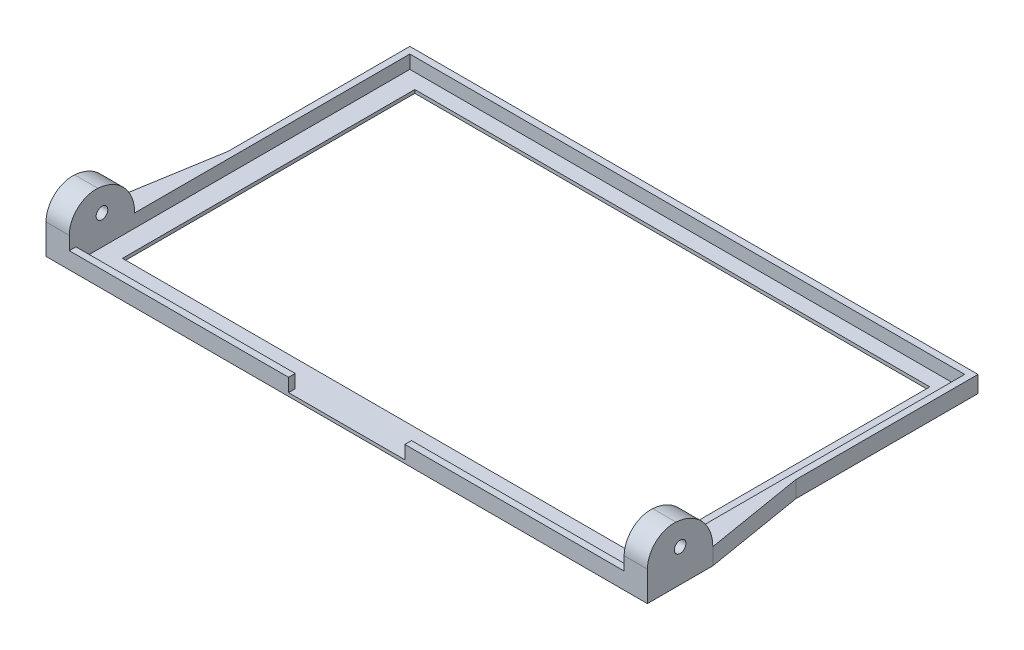
ISO-10303-21;
HEADER;
FILE_DESCRIPTION(('STEP AP214'),'2;1');
FILE_NAME('part.step','',(''),(''),'','','');
FILE_SCHEMA(('AUTOMOTIVE_DESIGN { 1 0 10303 214 1 1 1 1 }'));
ENDSEC;
DATA;
#1=APPLICATION_CONTEXT('core data for automotive mechanical design processes');
#2=APPLICATION_PROTOCOL_DEFINITION('international standard','automotive_design',2000,#1);
#3=PRODUCT_CONTEXT('',#1,'mechanical');
#4=PRODUCT('Part','Part','',(#3));
#5=PRODUCT_RELATED_PRODUCT_CATEGORY('part','',(#4));
#6=PRODUCT_DEFINITION_FORMATION('','',#4);
#7=PRODUCT_DEFINITION_CONTEXT('part definition',#1,'design');
#8=PRODUCT_DEFINITION('design','',#6,#7);
#9=PRODUCT_DEFINITION_SHAPE('','',#8);
#10=(LENGTH_UNIT() NAMED_UNIT(*) SI_UNIT(.MILLI.,.METRE.));
#11=(NAMED_UNIT(*) PLANE_ANGLE_UNIT() SI_UNIT($,.RADIAN.));
#12=(NAMED_UNIT(*) SI_UNIT($,.STERADIAN.) SOLID_ANGLE_UNIT());
#13=UNCERTAINTY_MEASURE_WITH_UNIT(LENGTH_MEASURE(1.E-05),#10,'distance_accuracy_value','');
#14=(GEOMETRIC_REPRESENTATION_CONTEXT(3) GLOBAL_UNCERTAINTY_ASSIGNED_CONTEXT((#13)) GLOBAL_UNIT_ASSIGNED_CONTEXT((#10,
#11,#12)) REPRESENTATION_CONTEXT('',''));
#15=CARTESIAN_POINT('',(0.,0.,0.));
#16=DIRECTION('',(0.,0.,1.));
#17=DIRECTION('',(1.,0.,0.));
#18=AXIS2_PLACEMENT_3D('',#15,#16,#17);
#19=CARTESIAN_POINT('',(0.,5.,0.));
#20=DIRECTION('',(0.,1.,0.));
#21=DIRECTION('',(0.,0.,1.));
#22=AXIS2_PLACEMENT_3D('',#19,#20,#21);
#23=PLANE('',#22);
#24=DIRECTION('',(0.,0.,1.));
#25=VECTOR('',#24,1.);
#26=CARTESIAN_POINT('',(83.5,5.,0.));
#27=LINE('',#26,#25);
#28=CARTESIAN_POINT('',(83.5,5.,52.));
#29=VERTEX_POINT('',#28);
#30=CARTESIAN_POINT('',(83.5000000000001,5.,54.));
#31=VERTEX_POINT('',#30);
#32=EDGE_CURVE('E257',#29,#31,#27,.T.);
#33=ORIENTED_EDGE('',*,*,#32,.F.);
#34=DIRECTION('',(1.,0.,0.));
#35=VECTOR('',#34,1.);
#36=CARTESIAN_POINT('',(-83.5,5.,52.));
#37=LINE('',#36,#35);
#38=CARTESIAN_POINT('',(17.5,5.,52.));
#39=VERTEX_POINT('',#38);
#40=EDGE_CURVE('E316',#39,#29,#37,.T.);
#41=ORIENTED_EDGE('',*,*,#40,.F.);
#42=DIRECTION('',(0.,0.,1.));
#43=VECTOR('',#42,1.);
#44=CARTESIAN_POINT('',(17.5,5.,0.));
#45=LINE('',#44,#43);
#46=CARTESIAN_POINT('',(17.5,5.,54.));
#47=VERTEX_POINT('',#46);
#48=EDGE_CURVE('E300',#39,#47,#45,.T.);
#49=ORIENTED_EDGE('',*,*,#48,.T.);
#50=DIRECTION('',(1.,0.,0.));
#51=VECTOR('',#50,1.);
#52=CARTESIAN_POINT('',(-85.5,5.,54.));
#53=LINE('',#52,#51);
#54=EDGE_CURVE('E361',#47,#31,#53,.T.);
#55=ORIENTED_EDGE('',*,*,#54,.T.);
#56=EDGE_LOOP('',(#33,#41,#49,#55));
#57=FACE_BOUND('',#56,.T.);
#58=ADVANCED_FACE('F41',(#57),#23,.T.);
#59=DIRECTION('',(0.,0.,-1.));
#60=VECTOR('',#59,1.);
#61=CARTESIAN_POINT('',(-83.5,5.,0.));
#62=LINE('',#61,#60);
#63=CARTESIAN_POINT('',(-83.5,5.,54.));
#64=VERTEX_POINT('',#63);
#65=CARTESIAN_POINT('',(-83.5,5.,52.));
#66=VERTEX_POINT('',#65);
#67=EDGE_CURVE('E278',#64,#66,#62,.T.);
#68=ORIENTED_EDGE('',*,*,#67,.F.);
#69=CARTESIAN_POINT('',(-17.5,5.,54.));
#70=VERTEX_POINT('',#69);
#71=EDGE_CURVE('E362',#64,#70,#53,.T.);
#72=ORIENTED_EDGE('',*,*,#71,.T.);
#73=DIRECTION('',(0.,0.,-1.));
#74=VECTOR('',#73,1.);
#75=CARTESIAN_POINT('',(-17.5,5.,0.));
#76=LINE('',#75,#74);
#77=CARTESIAN_POINT('',(-17.5,5.,52.));
#78=VERTEX_POINT('',#77);
#79=EDGE_CURVE('E293',#70,#78,#76,.T.);
#80=ORIENTED_EDGE('',*,*,#79,.T.);
#81=EDGE_CURVE('E317',#66,#78,#37,.T.);
#82=ORIENTED_EDGE('',*,*,#81,.F.);
#83=EDGE_LOOP('',(#68,#72,#80,#82));
#84=FACE_BOUND('',#83,.T.);
#85=ADVANCED_FACE('F557',(#84),#23,.T.);
#86=CARTESIAN_POINT('',(85.5,1.,54.));
#87=DIRECTION('',(0.,0.,-1.));
#88=DIRECTION('',(-1.,0.,0.));
#89=AXIS2_PLACEMENT_3D('',#86,#87,#88);
#90=PLANE('',#89);
#91=DIRECTION('',(0.,1.,0.));
#92=VECTOR('',#91,1.);
#93=CARTESIAN_POINT('',(90.5,0.,54.));
#94=LINE('',#93,#92);
#95=CARTESIAN_POINT('',(90.5,0.,54.));
#96=VERTEX_POINT('',#95);
#97=CARTESIAN_POINT('',(90.5,8.98839697397424,54.));
#98=VERTEX_POINT('',#97);
#99=EDGE_CURVE('E212',#96,#98,#94,.T.);
#100=ORIENTED_EDGE('',*,*,#99,.T.);
#101=DIRECTION('',(1.,0.,0.));
#102=VECTOR('',#101,1.);
#103=CARTESIAN_POINT('',(83.5000000000001,8.98839697397424,54.));
#104=LINE('',#103,#102);
#105=CARTESIAN_POINT('',(83.5,8.98839697397424,54.));
#106=VERTEX_POINT('',#105);
#107=EDGE_CURVE('E477',#98,#106,#104,.F.);
#108=ORIENTED_EDGE('',*,*,#107,.T.);
#109=DIRECTION('',(0.,1.,0.));
#110=VECTOR('',#109,1.);
#111=CARTESIAN_POINT('',(83.5,0.,54.));
#112=LINE('',#111,#110);
#113=EDGE_CURVE('E233',#31,#106,#112,.T.);
#114=ORIENTED_EDGE('',*,*,#113,.F.);
#115=ORIENTED_EDGE('',*,*,#54,.F.);
#116=DIRECTION('',(0.,1.,0.));
#117=VECTOR('',#116,1.);
#118=CARTESIAN_POINT('',(17.5,1.,54.));
#119=LINE('',#118,#117);
#120=CARTESIAN_POINT('',(17.5,1.,54.));
#121=VERTEX_POINT('',#120);
#122=EDGE_CURVE('E304',#121,#47,#119,.T.);
#123=ORIENTED_EDGE('',*,*,#122,.F.);
#124=DIRECTION('',(-1.,0.,0.));
#125=VECTOR('',#124,1.);
#126=CARTESIAN_POINT('',(85.5,1.,54.));
#127=LINE('',#126,#125);
#128=CARTESIAN_POINT('',(-17.5,1.,54.));
#129=VERTEX_POINT('',#128);
#130=EDGE_CURVE('E289',#121,#129,#127,.T.);
#131=ORIENTED_EDGE('',*,*,#130,.T.);
#132=DIRECTION('',(0.,-1.,0.));
#133=VECTOR('',#132,1.);
#134=CARTESIAN_POINT('',(-17.5,1.,54.));
#135=LINE('',#134,#133);
#136=EDGE_CURVE('E297',#70,#129,#135,.T.);
#137=ORIENTED_EDGE('',*,*,#136,.F.);
#138=ORIENTED_EDGE('',*,*,#71,.F.);
#139=DIRECTION('',(0.,1.,0.));
#140=VECTOR('',#139,1.);
#141=CARTESIAN_POINT('',(-83.5,0.,54.));
#142=LINE('',#141,#140);
#143=CARTESIAN_POINT('',(-83.5,8.98839697397422,54.));
#144=VERTEX_POINT('',#143);
#145=EDGE_CURVE('E265',#64,#144,#142,.T.);
#146=ORIENTED_EDGE('',*,*,#145,.T.);
#147=DIRECTION('',(-1.,0.,0.));
#148=VECTOR('',#147,1.);
#149=CARTESIAN_POINT('',(-90.5,8.98839697397422,54.));
#150=LINE('',#149,#148);
#151=CARTESIAN_POINT('',(-90.5,8.98839697397422,54.));
#152=VERTEX_POINT('',#151);
#153=EDGE_CURVE('E474',#144,#152,#150,.T.);
#154=ORIENTED_EDGE('',*,*,#153,.T.);
#155=DIRECTION('',(0.,1.,0.));
#156=VECTOR('',#155,1.);
#157=CARTESIAN_POINT('',(-90.5,0.,54.));
#158=LINE('',#157,#156);
#159=CARTESIAN_POINT('',(-90.5,0.,54.));
#160=VERTEX_POINT('',#159);
#161=EDGE_CURVE('E214',#160,#152,#158,.T.);
#162=ORIENTED_EDGE('',*,*,#161,.F.);
#163=DIRECTION('',(1.,0.,0.));
#164=VECTOR('',#163,1.);
#165=CARTESIAN_POINT('',(85.5,0.,54.));
#166=LINE('',#165,#164);
#167=EDGE_CURVE('E209',#160,#96,#166,.T.);
#168=ORIENTED_EDGE('',*,*,#167,.T.);
#169=EDGE_LOOP('',(#100,#108,#114,#115,#123,#131,#137,#138,#146,#154,#162,#168));
#170=FACE_BOUND('',#169,.T.);
#171=ADVANCED_FACE('F211',(#170),#90,.F.);
#172=DIRECTION('',(-1.,0.,0.));
#173=VECTOR('',#172,1.);
#174=CARTESIAN_POINT('',(-1.0201497275291E-13,5.,34.3044496312908));
#175=LINE('',#174,#173);
#176=CARTESIAN_POINT('',(90.5,5.,34.3044496312911));
#177=VERTEX_POINT('',#176);
#178=CARTESIAN_POINT('',(83.5,5.,34.3044496312911));
#179=VERTEX_POINT('',#178);
#180=EDGE_CURVE('E252',#177,#179,#175,.T.);
#181=ORIENTED_EDGE('',*,*,#180,.F.);
#182=DIRECTION('',(-0.164398987305361,0.,-0.986393923832143));
#183=VECTOR('',#182,1.);
#184=CARTESIAN_POINT('',(85.5,5.,4.30444963129168));
#185=LINE('',#184,#183);
#186=CARTESIAN_POINT('',(85.5,5.,4.30444963129164));
#187=VERTEX_POINT('',#186);
#188=EDGE_CURVE('E458',#177,#187,#185,.T.);
#189=ORIENTED_EDGE('',*,*,#188,.T.);
#190=DIRECTION('',(0.,0.,-1.));
#191=VECTOR('',#190,1.);
#192=CARTESIAN_POINT('',(85.5,5.,54.));
#193=LINE('',#192,#191);
#194=CARTESIAN_POINT('',(85.5,5.,-50.5));
#195=VERTEX_POINT('',#194);
#196=EDGE_CURVE('E365',#187,#195,#193,.T.);
#197=ORIENTED_EDGE('',*,*,#196,.T.);
#198=DIRECTION('',(-1.,0.,0.));
#199=VECTOR('',#198,1.);
#200=CARTESIAN_POINT('',(85.5,5.,-50.5));
#201=LINE('',#200,#199);
#202=CARTESIAN_POINT('',(-85.5,5.,-50.5));
#203=VERTEX_POINT('',#202);
#204=EDGE_CURVE('E353',#195,#203,#201,.T.);
#205=ORIENTED_EDGE('',*,*,#204,.T.);
#206=DIRECTION('',(0.,0.,1.));
#207=VECTOR('',#206,1.);
#208=CARTESIAN_POINT('',(-85.5,5.,-50.5));
#209=LINE('',#208,#207);
#210=CARTESIAN_POINT('',(-85.5,5.,4.30444963129165));
#211=VERTEX_POINT('',#210);
#212=EDGE_CURVE('E357',#203,#211,#209,.T.);
#213=ORIENTED_EDGE('',*,*,#212,.T.);
#214=DIRECTION('',(-0.164398987305361,0.,0.986393923832143));
#215=VECTOR('',#214,1.);
#216=CARTESIAN_POINT('',(-85.5,5.,4.3044496312917));
#217=LINE('',#216,#215);
#218=CARTESIAN_POINT('',(-90.5,5.,34.3044496312911));
#219=VERTEX_POINT('',#218);
#220=EDGE_CURVE('E461',#211,#219,#217,.T.);
#221=ORIENTED_EDGE('',*,*,#220,.T.);
#222=DIRECTION('',(-1.,0.,0.));
#223=VECTOR('',#222,1.);
#224=CARTESIAN_POINT('',(0.,5.,34.3044496312911));
#225=LINE('',#224,#223);
#226=CARTESIAN_POINT('',(-83.5,5.,34.3044496312911));
#227=VERTEX_POINT('',#226);
#228=EDGE_CURVE('E269',#227,#219,#225,.T.);
#229=ORIENTED_EDGE('',*,*,#228,.F.);
#230=DIRECTION('',(0.,0.,1.));
#231=VECTOR('',#230,1.);
#232=CARTESIAN_POINT('',(-83.5,5.,-48.5));
#233=LINE('',#232,#231);
#234=CARTESIAN_POINT('',(-83.5,5.,-48.5));
#235=VERTEX_POINT('',#234);
#236=EDGE_CURVE('E311',#235,#227,#233,.T.);
#237=ORIENTED_EDGE('',*,*,#236,.F.);
#238=DIRECTION('',(-1.,0.,0.));
#239=VECTOR('',#238,1.);
#240=CARTESIAN_POINT('',(83.5,5.,-48.5));
#241=LINE('',#240,#239);
#242=CARTESIAN_POINT('',(83.5,5.,-48.5));
#243=VERTEX_POINT('',#242);
#244=EDGE_CURVE('E308',#243,#235,#241,.T.);
#245=ORIENTED_EDGE('',*,*,#244,.F.);
#246=DIRECTION('',(0.,0.,-1.));
#247=VECTOR('',#246,1.);
#248=CARTESIAN_POINT('',(83.5,5.,52.));
#249=LINE('',#248,#247);
#250=EDGE_CURVE('E321',#179,#243,#249,.T.);
#251=ORIENTED_EDGE('',*,*,#250,.F.);
#252=EDGE_LOOP('',(#181,#189,#197,#205,#213,#221,#229,#237,#245,#251));
#253=FACE_BOUND('',#252,.T.);
#254=ADVANCED_FACE('F505',(#253),#23,.T.);
#255=CARTESIAN_POINT('',(-83.5,5.,52.));
#256=DIRECTION('',(0.,0.,-1.));
#257=DIRECTION('',(-1.,0.,0.));
#258=AXIS2_PLACEMENT_3D('',#255,#256,#257);
#259=PLANE('',#258);
#260=DIRECTION('',(1.,0.,0.));
#261=VECTOR('',#260,1.);
#262=CARTESIAN_POINT('',(-83.5,1.,52.));
#263=LINE('',#262,#261);
#264=CARTESIAN_POINT('',(17.5,1.,52.));
#265=VERTEX_POINT('',#264);
#266=CARTESIAN_POINT('',(83.5,1.,52.));
#267=VERTEX_POINT('',#266);
#268=EDGE_CURVE('E331',#265,#267,#263,.T.);
#269=ORIENTED_EDGE('',*,*,#268,.F.);
#270=DIRECTION('',(0.,1.,0.));
#271=VECTOR('',#270,1.);
#272=CARTESIAN_POINT('',(17.5,5.,52.));
#273=LINE('',#272,#271);
#274=EDGE_CURVE('E431',#265,#39,#273,.T.);
#275=ORIENTED_EDGE('',*,*,#274,.T.);
#276=ORIENTED_EDGE('',*,*,#40,.T.);
#277=DIRECTION('',(0.,-1.,0.));
#278=VECTOR('',#277,1.);
#279=CARTESIAN_POINT('',(83.5,5.,52.));
#280=LINE('',#279,#278);
#281=EDGE_CURVE('E341',#29,#267,#280,.T.);
#282=ORIENTED_EDGE('',*,*,#281,.T.);
#283=EDGE_LOOP('',(#269,#275,#276,#282));
#284=FACE_BOUND('',#283,.T.);
#285=ADVANCED_FACE('F537',(#284),#259,.T.);
#286=ORIENTED_EDGE('',*,*,#81,.T.);
#287=DIRECTION('',(0.,-1.,0.));
#288=VECTOR('',#287,1.);
#289=CARTESIAN_POINT('',(-17.5,5.,52.));
#290=LINE('',#289,#288);
#291=CARTESIAN_POINT('',(-17.5,1.,52.));
#292=VERTEX_POINT('',#291);
#293=EDGE_CURVE('E427',#78,#292,#290,.T.);
#294=ORIENTED_EDGE('',*,*,#293,.T.);
#295=CARTESIAN_POINT('',(-83.5,1.,52.));
#296=VERTEX_POINT('',#295);
#297=EDGE_CURVE('E332',#296,#292,#263,.T.);
#298=ORIENTED_EDGE('',*,*,#297,.F.);
#299=DIRECTION('',(0.,-1.,0.));
#300=VECTOR('',#299,1.);
#301=CARTESIAN_POINT('',(-83.5,5.,52.));
#302=LINE('',#301,#300);
#303=EDGE_CURVE('E345',#66,#296,#302,.T.);
#304=ORIENTED_EDGE('',*,*,#303,.F.);
#305=EDGE_LOOP('',(#286,#294,#298,#304));
#306=FACE_BOUND('',#305,.T.);
#307=ADVANCED_FACE('F554',(#306),#259,.T.);
#308=CARTESIAN_POINT('',(0.,1.,0.));
#309=DIRECTION('',(0.,-1.,0.));
#310=DIRECTION('',(0.,0.,-1.));
#311=AXIS2_PLACEMENT_3D('',#308,#309,#310);
#312=PLANE('',#311);
#313=DIRECTION('',(0.,0.,-1.));
#314=VECTOR('',#313,1.);
#315=CARTESIAN_POINT('',(17.5,1.,56.3496861293904));
#316=LINE('',#315,#314);
#317=EDGE_CURVE('E282',#121,#265,#316,.T.);
#318=ORIENTED_EDGE('',*,*,#317,.T.);
#319=ORIENTED_EDGE('',*,*,#268,.T.);
#320=DIRECTION('',(0.,0.,-1.));
#321=VECTOR('',#320,1.);
#322=CARTESIAN_POINT('',(83.5,1.,52.));
#323=LINE('',#322,#321);
#324=CARTESIAN_POINT('',(83.5,1.,-48.5));
#325=VERTEX_POINT('',#324);
#326=EDGE_CURVE('E312',#267,#325,#323,.T.);
#327=ORIENTED_EDGE('',*,*,#326,.T.);
#328=DIRECTION('',(-1.,0.,0.));
#329=VECTOR('',#328,1.);
#330=CARTESIAN_POINT('',(83.5,1.,-48.5));
#331=LINE('',#330,#329);
#332=CARTESIAN_POINT('',(-83.5,1.,-48.5));
#333=VERTEX_POINT('',#332);
#334=EDGE_CURVE('E307',#325,#333,#331,.T.);
#335=ORIENTED_EDGE('',*,*,#334,.T.);
#336=DIRECTION('',(0.,0.,1.));
#337=VECTOR('',#336,1.);
#338=CARTESIAN_POINT('',(-83.5,1.,-48.5));
#339=LINE('',#338,#337);
#340=EDGE_CURVE('E328',#333,#296,#339,.T.);
#341=ORIENTED_EDGE('',*,*,#340,.T.);
#342=ORIENTED_EDGE('',*,*,#297,.T.);
#343=DIRECTION('',(0.,0.,1.));
#344=VECTOR('',#343,1.);
#345=CARTESIAN_POINT('',(-17.5,1.,56.3496861293904));
#346=LINE('',#345,#344);
#347=EDGE_CURVE('E285',#292,#129,#346,.T.);
#348=ORIENTED_EDGE('',*,*,#347,.T.);
#349=ORIENTED_EDGE('',*,*,#130,.F.);
#350=EDGE_LOOP('',(#318,#319,#327,#335,#341,#342,#348,#349));
#351=FACE_BOUND('',#350,.T.);
#352=DIRECTION('',(0.,0.,-1.));
#353=VECTOR('',#352,1.);
#354=CARTESIAN_POINT('',(77.5,1.,44.));
#355=LINE('',#354,#353);
#356=CARTESIAN_POINT('',(77.5,1.,44.));
#357=VERTEX_POINT('',#356);
#358=CARTESIAN_POINT('',(77.5,1.,-44.));
#359=VERTEX_POINT('',#358);
#360=EDGE_CURVE('E369',#357,#359,#355,.T.);
#361=ORIENTED_EDGE('',*,*,#360,.F.);
#362=DIRECTION('',(1.,0.,0.));
#363=VECTOR('',#362,1.);
#364=CARTESIAN_POINT('',(-77.5,1.,44.));
#365=LINE('',#364,#363);
#366=CARTESIAN_POINT('',(-77.5,1.,44.));
#367=VERTEX_POINT('',#366);
#368=EDGE_CURVE('E380',#367,#357,#365,.T.);
#369=ORIENTED_EDGE('',*,*,#368,.F.);
#370=DIRECTION('',(0.,0.,1.));
#371=VECTOR('',#370,1.);
#372=CARTESIAN_POINT('',(-77.5,1.,44.));
#373=LINE('',#372,#371);
#374=CARTESIAN_POINT('',(-77.5,1.,-44.));
#375=VERTEX_POINT('',#374);
#376=EDGE_CURVE('E376',#375,#367,#373,.T.);
#377=ORIENTED_EDGE('',*,*,#376,.F.);
#378=DIRECTION('',(-1.,0.,0.));
#379=VECTOR('',#378,1.);
#380=CARTESIAN_POINT('',(-77.5,1.,-44.));
#381=LINE('',#380,#379);
#382=EDGE_CURVE('E372',#359,#375,#381,.T.);
#383=ORIENTED_EDGE('',*,*,#382,.F.);
#384=EDGE_LOOP('',(#361,#369,#377,#383));
#385=FACE_BOUND('',#384,.T.);
#386=ADVANCED_FACE('F542',(#351,#385),#312,.F.);
#387=CARTESIAN_POINT('',(0.,0.,0.));
#388=DIRECTION('',(0.,-1.,0.));
#389=DIRECTION('',(0.,0.,-1.));
#390=AXIS2_PLACEMENT_3D('',#387,#388,#389);
#391=PLANE('',#390);
#392=DIRECTION('',(0.,0.,-1.));
#393=VECTOR('',#392,1.);
#394=CARTESIAN_POINT('',(90.5,0.,34.3044496312911));
#395=LINE('',#394,#393);
#396=CARTESIAN_POINT('',(90.5,0.,34.3044496312911));
#397=VERTEX_POINT('',#396);
#398=EDGE_CURVE('E228',#96,#397,#395,.T.);
#399=ORIENTED_EDGE('',*,*,#398,.F.);
#400=ORIENTED_EDGE('',*,*,#167,.F.);
#401=DIRECTION('',(0.,0.,1.));
#402=VECTOR('',#401,1.);
#403=CARTESIAN_POINT('',(-90.5,0.,34.3044496312911));
#404=LINE('',#403,#402);
#405=CARTESIAN_POINT('',(-90.5,0.,34.3044496312911));
#406=VERTEX_POINT('',#405);
#407=EDGE_CURVE('E261',#406,#160,#404,.T.);
#408=ORIENTED_EDGE('',*,*,#407,.F.);
#409=DIRECTION('',(0.164398987305361,0.,-0.986393923832143));
#410=VECTOR('',#409,1.);
#411=CARTESIAN_POINT('',(-85.5,0.,4.3044496312917));
#412=LINE('',#411,#410);
#413=CARTESIAN_POINT('',(-85.5,0.,4.30444963129167));
#414=VERTEX_POINT('',#413);
#415=EDGE_CURVE('E465',#406,#414,#412,.T.);
#416=ORIENTED_EDGE('',*,*,#415,.T.);
#417=DIRECTION('',(0.,0.,1.));
#418=VECTOR('',#417,1.);
#419=CARTESIAN_POINT('',(-85.5,0.,54.));
#420=LINE('',#419,#418);
#421=CARTESIAN_POINT('',(-85.5,0.,-50.5));
#422=VERTEX_POINT('',#421);
#423=EDGE_CURVE('E221',#422,#414,#420,.T.);
#424=ORIENTED_EDGE('',*,*,#423,.F.);
#425=DIRECTION('',(-1.,0.,0.));
#426=VECTOR('',#425,1.);
#427=CARTESIAN_POINT('',(-85.5,0.,-50.5));
#428=LINE('',#427,#426);
#429=CARTESIAN_POINT('',(85.5,0.,-50.5));
#430=VERTEX_POINT('',#429);
#431=EDGE_CURVE('E416',#430,#422,#428,.T.);
#432=ORIENTED_EDGE('',*,*,#431,.F.);
#433=DIRECTION('',(0.,0.,-1.));
#434=VECTOR('',#433,1.);
#435=CARTESIAN_POINT('',(85.5,0.,-50.5));
#436=LINE('',#435,#434);
#437=CARTESIAN_POINT('',(85.5,0.,4.30444963129164));
#438=VERTEX_POINT('',#437);
#439=EDGE_CURVE('E220',#438,#430,#436,.T.);
#440=ORIENTED_EDGE('',*,*,#439,.F.);
#441=DIRECTION('',(0.164398987305361,0.,0.986393923832143));
#442=VECTOR('',#441,1.);
#443=CARTESIAN_POINT('',(85.5,0.,4.30444963129168));
#444=LINE('',#443,#442);
#445=EDGE_CURVE('E238',#438,#397,#444,.T.);
#446=ORIENTED_EDGE('',*,*,#445,.T.);
#447=EDGE_LOOP('',(#399,#400,#408,#416,#424,#432,#440,#446));
#448=FACE_BOUND('',#447,.T.);
#449=DIRECTION('',(1.,0.,0.));
#450=VECTOR('',#449,1.);
#451=CARTESIAN_POINT('',(-77.5,0.,44.));
#452=LINE('',#451,#450);
#453=CARTESIAN_POINT('',(-77.5,0.,44.));
#454=VERTEX_POINT('',#453);
#455=CARTESIAN_POINT('',(77.5,0.,44.));
#456=VERTEX_POINT('',#455);
#457=EDGE_CURVE('E373',#454,#456,#452,.T.);
#458=ORIENTED_EDGE('',*,*,#457,.T.);
#459=DIRECTION('',(0.,0.,-1.));
#460=VECTOR('',#459,1.);
#461=CARTESIAN_POINT('',(77.5,0.,44.));
#462=LINE('',#461,#460);
#463=CARTESIAN_POINT('',(77.5,0.,-44.));
#464=VERTEX_POINT('',#463);
#465=EDGE_CURVE('E368',#456,#464,#462,.T.);
#466=ORIENTED_EDGE('',*,*,#465,.T.);
#467=DIRECTION('',(-1.,0.,0.));
#468=VECTOR('',#467,1.);
#469=CARTESIAN_POINT('',(-77.5,0.,-44.));
#470=LINE('',#469,#468);
#471=CARTESIAN_POINT('',(-77.5,0.,-44.));
#472=VERTEX_POINT('',#471);
#473=EDGE_CURVE('E387',#464,#472,#470,.T.);
#474=ORIENTED_EDGE('',*,*,#473,.T.);
#475=DIRECTION('',(0.,0.,1.));
#476=VECTOR('',#475,1.);
#477=CARTESIAN_POINT('',(-77.5,0.,44.));
#478=LINE('',#477,#476);
#479=EDGE_CURVE('E391',#472,#454,#478,.T.);
#480=ORIENTED_EDGE('',*,*,#479,.T.);
#481=EDGE_LOOP('',(#458,#466,#474,#480));
#482=FACE_BOUND('',#481,.T.);
#483=ADVANCED_FACE('F235',(#448,#482),#391,.T.);
#484=CARTESIAN_POINT('',(-85.5,1.,54.));
#485=DIRECTION('',(1.,0.,0.));
#486=DIRECTION('',(0.,0.,-1.));
#487=AXIS2_PLACEMENT_3D('',#484,#485,#486);
#488=PLANE('',#487);
#489=ORIENTED_EDGE('',*,*,#423,.T.);
#490=DIRECTION('',(0.,1.,0.));
#491=VECTOR('',#490,1.);
#492=CARTESIAN_POINT('',(-85.5,1.,4.30444963129166));
#493=LINE('',#492,#491);
#494=EDGE_CURVE('E452',#414,#211,#493,.T.);
#495=ORIENTED_EDGE('',*,*,#494,.T.);
#496=ORIENTED_EDGE('',*,*,#212,.F.);
#497=DIRECTION('',(0.,-1.,0.));
#498=VECTOR('',#497,1.);
#499=CARTESIAN_POINT('',(-85.5,1.,-50.5));
#500=LINE('',#499,#498);
#501=EDGE_CURVE('E419',#203,#422,#500,.T.);
#502=ORIENTED_EDGE('',*,*,#501,.T.);
#503=EDGE_LOOP('',(#489,#495,#496,#502));
#504=FACE_BOUND('',#503,.T.);
#505=ADVANCED_FACE('F503',(#504),#488,.F.);
#506=CARTESIAN_POINT('',(85.5,1.,-50.5));
#507=DIRECTION('',(-1.,0.,0.));
#508=DIRECTION('',(0.,0.,1.));
#509=AXIS2_PLACEMENT_3D('',#506,#507,#508);
#510=PLANE('',#509);
#511=ORIENTED_EDGE('',*,*,#196,.F.);
#512=DIRECTION('',(0.,-1.,0.));
#513=VECTOR('',#512,1.);
#514=CARTESIAN_POINT('',(85.5,1.,4.30444963129164));
#515=LINE('',#514,#513);
#516=EDGE_CURVE('E448',#187,#438,#515,.T.);
#517=ORIENTED_EDGE('',*,*,#516,.T.);
#518=ORIENTED_EDGE('',*,*,#439,.T.);
#519=DIRECTION('',(0.,-1.,0.));
#520=VECTOR('',#519,1.);
#521=CARTESIAN_POINT('',(85.5,1.,-50.5));
#522=LINE('',#521,#520);
#523=EDGE_CURVE('E423',#195,#430,#522,.T.);
#524=ORIENTED_EDGE('',*,*,#523,.F.);
#525=EDGE_LOOP('',(#511,#517,#518,#524));
#526=FACE_BOUND('',#525,.T.);
#527=ADVANCED_FACE('F513',(#526),#510,.F.);
#528=CARTESIAN_POINT('',(-85.5,1.,-50.5));
#529=DIRECTION('',(0.,0.,1.));
#530=DIRECTION('',(1.,0.,0.));
#531=AXIS2_PLACEMENT_3D('',#528,#529,#530);
#532=PLANE('',#531);
#533=ORIENTED_EDGE('',*,*,#431,.T.);
#534=ORIENTED_EDGE('',*,*,#501,.F.);
#535=ORIENTED_EDGE('',*,*,#204,.F.);
#536=ORIENTED_EDGE('',*,*,#523,.T.);
#537=EDGE_LOOP('',(#533,#534,#535,#536));
#538=FACE_BOUND('',#537,.T.);
#539=ADVANCED_FACE('F510',(#538),#532,.F.);
#540=CARTESIAN_POINT('',(77.5,1.,44.));
#541=DIRECTION('',(-1.,0.,0.));
#542=DIRECTION('',(0.,0.,1.));
#543=AXIS2_PLACEMENT_3D('',#540,#541,#542);
#544=PLANE('',#543);
#545=ORIENTED_EDGE('',*,*,#465,.F.);
#546=DIRECTION('',(0.,-1.,0.));
#547=VECTOR('',#546,1.);
#548=CARTESIAN_POINT('',(77.5,1.,44.));
#549=LINE('',#548,#547);
#550=EDGE_CURVE('E383',#357,#456,#549,.T.);
#551=ORIENTED_EDGE('',*,*,#550,.F.);
#552=ORIENTED_EDGE('',*,*,#360,.T.);
#553=DIRECTION('',(0.,-1.,0.));
#554=VECTOR('',#553,1.);
#555=CARTESIAN_POINT('',(77.5,1.,-44.));
#556=LINE('',#555,#554);
#557=EDGE_CURVE('E407',#359,#464,#556,.T.);
#558=ORIENTED_EDGE('',*,*,#557,.T.);
#559=EDGE_LOOP('',(#545,#551,#552,#558));
#560=FACE_BOUND('',#559,.T.);
#561=ADVANCED_FACE('F797',(#560),#544,.T.);
#562=CARTESIAN_POINT('',(-77.5,1.,-44.));
#563=DIRECTION('',(0.,0.,1.));
#564=DIRECTION('',(1.,0.,0.));
#565=AXIS2_PLACEMENT_3D('',#562,#563,#564);
#566=PLANE('',#565);
#567=ORIENTED_EDGE('',*,*,#473,.F.);
#568=ORIENTED_EDGE('',*,*,#557,.F.);
#569=ORIENTED_EDGE('',*,*,#382,.T.);
#570=DIRECTION('',(0.,-1.,0.));
#571=VECTOR('',#570,1.);
#572=CARTESIAN_POINT('',(-77.5,1.,-44.));
#573=LINE('',#572,#571);
#574=EDGE_CURVE('E404',#375,#472,#573,.T.);
#575=ORIENTED_EDGE('',*,*,#574,.T.);
#576=EDGE_LOOP('',(#567,#568,#569,#575));
#577=FACE_BOUND('',#576,.T.);
#578=ADVANCED_FACE('F804',(#577),#566,.T.);
#579=CARTESIAN_POINT('',(-77.5,1.,44.));
#580=DIRECTION('',(1.,0.,0.));
#581=DIRECTION('',(0.,0.,-1.));
#582=AXIS2_PLACEMENT_3D('',#579,#580,#581);
#583=PLANE('',#582);
#584=ORIENTED_EDGE('',*,*,#479,.F.);
#585=ORIENTED_EDGE('',*,*,#574,.F.);
#586=ORIENTED_EDGE('',*,*,#376,.T.);
#587=DIRECTION('',(0.,-1.,0.));
#588=VECTOR('',#587,1.);
#589=CARTESIAN_POINT('',(-77.5,1.,44.));
#590=LINE('',#589,#588);
#591=EDGE_CURVE('E401',#367,#454,#590,.T.);
#592=ORIENTED_EDGE('',*,*,#591,.T.);
#593=EDGE_LOOP('',(#584,#585,#586,#592));
#594=FACE_BOUND('',#593,.T.);
#595=ADVANCED_FACE('F575',(#594),#583,.T.);
#596=CARTESIAN_POINT('',(-77.5,1.,44.));
#597=DIRECTION('',(0.,0.,-1.));
#598=DIRECTION('',(-1.,0.,0.));
#599=AXIS2_PLACEMENT_3D('',#596,#597,#598);
#600=PLANE('',#599);
#601=ORIENTED_EDGE('',*,*,#457,.F.);
#602=ORIENTED_EDGE('',*,*,#591,.F.);
#603=ORIENTED_EDGE('',*,*,#368,.T.);
#604=ORIENTED_EDGE('',*,*,#550,.T.);
#605=EDGE_LOOP('',(#601,#602,#603,#604));
#606=FACE_BOUND('',#605,.T.);
#607=ADVANCED_FACE('F567',(#606),#600,.T.);
#608=CARTESIAN_POINT('',(83.5,5.,-48.5));
#609=DIRECTION('',(0.,0.,1.));
#610=DIRECTION('',(1.,0.,0.));
#611=AXIS2_PLACEMENT_3D('',#608,#609,#610);
#612=PLANE('',#611);
#613=ORIENTED_EDGE('',*,*,#334,.F.);
#614=DIRECTION('',(0.,-1.,0.));
#615=VECTOR('',#614,1.);
#616=CARTESIAN_POINT('',(83.5,5.,-48.5));
#617=LINE('',#616,#615);
#618=EDGE_CURVE('E324',#243,#325,#617,.T.);
#619=ORIENTED_EDGE('',*,*,#618,.F.);
#620=ORIENTED_EDGE('',*,*,#244,.T.);
#621=DIRECTION('',(0.,-1.,0.));
#622=VECTOR('',#621,1.);
#623=CARTESIAN_POINT('',(-83.5,5.,-48.5));
#624=LINE('',#623,#622);
#625=EDGE_CURVE('E349',#235,#333,#624,.T.);
#626=ORIENTED_EDGE('',*,*,#625,.T.);
#627=EDGE_LOOP('',(#613,#619,#620,#626));
#628=FACE_BOUND('',#627,.T.);
#629=ADVANCED_FACE('F562',(#628),#612,.T.);
#630=CARTESIAN_POINT('',(-83.5,5.,-48.5));
#631=DIRECTION('',(1.,0.,0.));
#632=DIRECTION('',(0.,0.,-1.));
#633=AXIS2_PLACEMENT_3D('',#630,#631,#632);
#634=PLANE('',#633);
#635=CARTESIAN_POINT('',(-83.5,9.892685603033,44.1522248156456));
#636=DIRECTION('',(1.,0.,0.));
#637=DIRECTION('',(0.,0.,-1.));
#638=AXIS2_PLACEMENT_3D('',#635,#636,#637);
#639=CIRCLE('',#638,1.75);
#640=CARTESIAN_POINT('',(-83.5,9.892685603033,42.4022248156456));
#641=VERTEX_POINT('',#640);
#642=EDGE_CURVE('E240',#641,#641,#639,.T.);
#643=ORIENTED_EDGE('',*,*,#642,.F.);
#644=EDGE_LOOP('',(#643));
#645=FACE_BOUND('',#644,.T.);
#646=CARTESIAN_POINT('',(-83.5,5.,46.3044496312911));
#647=DIRECTION('',(1.,0.,0.));
#648=DIRECTION('',(0.,0.,-1.));
#649=AXIS2_PLACEMENT_3D('',#646,#647,#648);
#650=CIRCLE('',#649,12.);
#651=CARTESIAN_POINT('',(-83.5,16.9651909219227,45.3911007374178));
#652=VERTEX_POINT('',#651);
#653=EDGE_CURVE('E444',#227,#652,#650,.T.);
#654=ORIENTED_EDGE('',*,*,#653,.T.);
#655=CARTESIAN_POINT('',(-83.5,8.98839697397422,46.));
#656=DIRECTION('',(1.,0.,0.));
#657=DIRECTION('',(0.,0.,-1.));
#658=AXIS2_PLACEMENT_3D('',#655,#656,#657);
#659=CIRCLE('',#658,8.);
#660=EDGE_CURVE('E51',#652,#144,#659,.T.);
#661=ORIENTED_EDGE('',*,*,#660,.T.);
#662=ORIENTED_EDGE('',*,*,#145,.F.);
#663=ORIENTED_EDGE('',*,*,#67,.T.);
#664=ORIENTED_EDGE('',*,*,#303,.T.);
#665=ORIENTED_EDGE('',*,*,#340,.F.);
#666=ORIENTED_EDGE('',*,*,#625,.F.);
#667=ORIENTED_EDGE('',*,*,#236,.T.);
#668=EDGE_LOOP('',(#654,#661,#662,#663,#664,#665,#666,#667));
#669=FACE_BOUND('',#668,.T.);
#670=ADVANCED_FACE('F489',(#645,#669),#634,.T.);
#671=CARTESIAN_POINT('',(83.5,5.,52.));
#672=DIRECTION('',(-1.,0.,0.));
#673=DIRECTION('',(0.,0.,1.));
#674=AXIS2_PLACEMENT_3D('',#671,#672,#673);
#675=PLANE('',#674);
#676=CARTESIAN_POINT('',(83.5,9.892685603033,44.1522248156456));
#677=DIRECTION('',(-1.,0.,0.));
#678=DIRECTION('',(0.,0.,1.));
#679=AXIS2_PLACEMENT_3D('',#676,#677,#678);
#680=CIRCLE('',#679,1.75);
#681=CARTESIAN_POINT('',(83.5,9.892685603033,45.9022248156456));
#682=VERTEX_POINT('',#681);
#683=EDGE_CURVE('E247',#682,#682,#680,.T.);
#684=ORIENTED_EDGE('',*,*,#683,.F.);
#685=EDGE_LOOP('',(#684));
#686=FACE_BOUND('',#685,.T.);
#687=ORIENTED_EDGE('',*,*,#113,.T.);
#688=CARTESIAN_POINT('',(83.5,8.98839697397424,46.0000000000003));
#689=DIRECTION('',(-1.,0.,0.));
#690=DIRECTION('',(0.,0.,1.));
#691=AXIS2_PLACEMENT_3D('',#688,#689,#690);
#692=CIRCLE('',#691,8.);
#693=CARTESIAN_POINT('',(83.5,16.9651909219227,45.3911007374186));
#694=VERTEX_POINT('',#693);
#695=EDGE_CURVE('E480',#106,#694,#692,.T.);
#696=ORIENTED_EDGE('',*,*,#695,.T.);
#697=CARTESIAN_POINT('',(83.5,5.,46.3044496312911));
#698=DIRECTION('',(-1.,0.,0.));
#699=DIRECTION('',(0.,0.,1.));
#700=AXIS2_PLACEMENT_3D('',#697,#698,#699);
#701=CIRCLE('',#700,12.);
#702=EDGE_CURVE('E435',#694,#179,#701,.T.);
#703=ORIENTED_EDGE('',*,*,#702,.T.);
#704=ORIENTED_EDGE('',*,*,#250,.T.);
#705=ORIENTED_EDGE('',*,*,#618,.T.);
#706=ORIENTED_EDGE('',*,*,#326,.F.);
#707=ORIENTED_EDGE('',*,*,#281,.F.);
#708=ORIENTED_EDGE('',*,*,#32,.T.);
#709=EDGE_LOOP('',(#687,#696,#703,#704,#705,#706,#707,#708));
#710=FACE_BOUND('',#709,.T.);
#711=ADVANCED_FACE('F529',(#686,#710),#675,.T.);
#712=CARTESIAN_POINT('',(17.5,15.,56.3496861293904));
#713=DIRECTION('',(-1.,0.,0.));
#714=DIRECTION('',(0.,0.,1.));
#715=AXIS2_PLACEMENT_3D('',#712,#713,#714);
#716=PLANE('',#715);
#717=ORIENTED_EDGE('',*,*,#122,.T.);
#718=ORIENTED_EDGE('',*,*,#48,.F.);
#719=ORIENTED_EDGE('',*,*,#274,.F.);
#720=ORIENTED_EDGE('',*,*,#317,.F.);
#721=EDGE_LOOP('',(#717,#718,#719,#720));
#722=FACE_BOUND('',#721,.T.);
#723=ADVANCED_FACE('F547',(#722),#716,.T.);
#724=CARTESIAN_POINT('',(-17.5,15.,56.3496861293904));
#725=DIRECTION('',(1.,0.,0.));
#726=DIRECTION('',(0.,0.,-1.));
#727=AXIS2_PLACEMENT_3D('',#724,#725,#726);
#728=PLANE('',#727);
#729=ORIENTED_EDGE('',*,*,#136,.T.);
#730=ORIENTED_EDGE('',*,*,#347,.F.);
#731=ORIENTED_EDGE('',*,*,#293,.F.);
#732=ORIENTED_EDGE('',*,*,#79,.F.);
#733=EDGE_LOOP('',(#729,#730,#731,#732));
#734=FACE_BOUND('',#733,.T.);
#735=ADVANCED_FACE('F551',(#734),#728,.T.);
#736=CARTESIAN_POINT('',(-90.5,0.,34.3044496312911));
#737=DIRECTION('',(-1.,0.,0.));
#738=DIRECTION('',(0.,0.,1.));
#739=AXIS2_PLACEMENT_3D('',#736,#737,#738);
#740=PLANE('',#739);
#741=CARTESIAN_POINT('',(-90.5,9.892685603033,44.1522248156456));
#742=DIRECTION('',(-1.,0.,0.));
#743=DIRECTION('',(0.,0.,1.));
#744=AXIS2_PLACEMENT_3D('',#741,#742,#743);
#745=CIRCLE('',#744,1.75);
#746=CARTESIAN_POINT('',(-90.5,9.892685603033,45.9022248156456));
#747=VERTEX_POINT('',#746);
#748=EDGE_CURVE('E646',#747,#747,#745,.T.);
#749=ORIENTED_EDGE('',*,*,#748,.F.);
#750=EDGE_LOOP('',(#749));
#751=FACE_BOUND('',#750,.T.);
#752=ORIENTED_EDGE('',*,*,#161,.T.);
#753=CARTESIAN_POINT('',(-90.5,8.98839697397422,46.));
#754=DIRECTION('',(-1.,0.,0.));
#755=DIRECTION('',(0.,0.,1.));
#756=AXIS2_PLACEMENT_3D('',#753,#754,#755);
#757=CIRCLE('',#756,8.);
#758=CARTESIAN_POINT('',(-90.5,16.9651909219227,45.3911007374178));
#759=VERTEX_POINT('',#758);
#760=EDGE_CURVE('E11',#152,#759,#757,.T.);
#761=ORIENTED_EDGE('',*,*,#760,.T.);
#762=CARTESIAN_POINT('',(-90.5,5.,46.3044496312911));
#763=DIRECTION('',(-1.,0.,0.));
#764=DIRECTION('',(0.,0.,1.));
#765=AXIS2_PLACEMENT_3D('',#762,#763,#764);
#766=CIRCLE('',#765,12.);
#767=EDGE_CURVE('E441',#759,#219,#766,.T.);
#768=ORIENTED_EDGE('',*,*,#767,.T.);
#769=DIRECTION('',(0.,1.,0.));
#770=VECTOR('',#769,1.);
#771=CARTESIAN_POINT('',(-90.5,0.,34.3044496312911));
#772=LINE('',#771,#770);
#773=EDGE_CURVE('E264',#406,#219,#772,.T.);
#774=ORIENTED_EDGE('',*,*,#773,.F.);
#775=ORIENTED_EDGE('',*,*,#407,.T.);
#776=EDGE_LOOP('',(#752,#761,#768,#774,#775));
#777=FACE_BOUND('',#776,.T.);
#778=ADVANCED_FACE('F495',(#751,#777),#740,.T.);
#779=CARTESIAN_POINT('',(90.5,0.,34.3044496312911));
#780=DIRECTION('',(1.,0.,0.));
#781=DIRECTION('',(0.,0.,-1.));
#782=AXIS2_PLACEMENT_3D('',#779,#780,#781);
#783=PLANE('',#782);
#784=CARTESIAN_POINT('',(90.5,9.892685603033,44.1522248156456));
#785=DIRECTION('',(1.,0.,0.));
#786=DIRECTION('',(0.,0.,-1.));
#787=AXIS2_PLACEMENT_3D('',#784,#785,#786);
#788=CIRCLE('',#787,1.75);
#789=CARTESIAN_POINT('',(90.5,9.892685603033,42.4022248156456));
#790=VERTEX_POINT('',#789);
#791=EDGE_CURVE('E45',#790,#790,#788,.T.);
#792=ORIENTED_EDGE('',*,*,#791,.F.);
#793=EDGE_LOOP('',(#792));
#794=FACE_BOUND('',#793,.T.);
#795=CARTESIAN_POINT('',(90.5,5.,46.3044496312911));
#796=DIRECTION('',(1.,0.,0.));
#797=DIRECTION('',(0.,0.,-1.));
#798=AXIS2_PLACEMENT_3D('',#795,#796,#797);
#799=CIRCLE('',#798,12.);
#800=CARTESIAN_POINT('',(90.5,16.9651909219227,45.3911007374187));
#801=VERTEX_POINT('',#800);
#802=EDGE_CURVE('E438',#177,#801,#799,.T.);
#803=ORIENTED_EDGE('',*,*,#802,.T.);
#804=CARTESIAN_POINT('',(90.5,8.98839697397424,46.0000000000003));
#805=DIRECTION('',(1.,0.,0.));
#806=DIRECTION('',(0.,0.,-1.));
#807=AXIS2_PLACEMENT_3D('',#804,#805,#806);
#808=CIRCLE('',#807,8.);
#809=EDGE_CURVE('E230',#801,#98,#808,.T.);
#810=ORIENTED_EDGE('',*,*,#809,.T.);
#811=ORIENTED_EDGE('',*,*,#99,.F.);
#812=ORIENTED_EDGE('',*,*,#398,.T.);
#813=DIRECTION('',(0.,1.,0.));
#814=VECTOR('',#813,1.);
#815=CARTESIAN_POINT('',(90.5,0.,34.3044496312911));
#816=LINE('',#815,#814);
#817=EDGE_CURVE('E232',#397,#177,#816,.T.);
#818=ORIENTED_EDGE('',*,*,#817,.T.);
#819=EDGE_LOOP('',(#803,#810,#811,#812,#818));
#820=FACE_BOUND('',#819,.T.);
#821=ADVANCED_FACE('F226',(#794,#820),#783,.T.);
#822=CARTESIAN_POINT('',(-1.37700712830148E-13,5.,46.3044496312908));
#823=DIRECTION('',(-1.,0.,0.));
#824=DIRECTION('',(0.,0.,1.));
#825=AXIS2_PLACEMENT_3D('',#822,#823,#824);
#826=CYLINDRICAL_SURFACE('',#825,12.);
#827=ORIENTED_EDGE('',*,*,#702,.F.);
#828=DIRECTION('',(-1.,0.,0.));
#829=VECTOR('',#828,1.);
#830=CARTESIAN_POINT('',(-1.34984585227934E-13,16.9651909219227,45.3911007374184));
#831=LINE('',#830,#829);
#832=EDGE_CURVE('E468',#694,#801,#831,.F.);
#833=ORIENTED_EDGE('',*,*,#832,.T.);
#834=ORIENTED_EDGE('',*,*,#802,.F.);
#835=ORIENTED_EDGE('',*,*,#180,.T.);
#836=EDGE_LOOP('',(#827,#833,#834,#835));
#837=FACE_BOUND('',#836,.T.);
#838=ADVANCED_FACE('F521',(#837),#826,.T.);
#839=CARTESIAN_POINT('',(0.,5.,46.3044496312911));
#840=DIRECTION('',(1.,0.,0.));
#841=DIRECTION('',(0.,0.,-1.));
#842=AXIS2_PLACEMENT_3D('',#839,#840,#841);
#843=CYLINDRICAL_SURFACE('',#842,12.);
#844=ORIENTED_EDGE('',*,*,#767,.F.);
#845=DIRECTION('',(1.,0.,0.));
#846=VECTOR('',#845,1.);
#847=CARTESIAN_POINT('',(0.,16.9651909219227,45.3911007374178));
#848=LINE('',#847,#846);
#849=EDGE_CURVE('E483',#759,#652,#848,.T.);
#850=ORIENTED_EDGE('',*,*,#849,.T.);
#851=ORIENTED_EDGE('',*,*,#653,.F.);
#852=ORIENTED_EDGE('',*,*,#228,.T.);
#853=EDGE_LOOP('',(#844,#850,#851,#852));
#854=FACE_BOUND('',#853,.T.);
#855=ADVANCED_FACE('F494',(#854),#843,.T.);
#856=CARTESIAN_POINT('',(85.5,1.,4.30444963129168));
#857=DIRECTION('',(-0.986393923832143,0.,0.164398987305361));
#858=DIRECTION('',(0.,-1.,0.));
#859=AXIS2_PLACEMENT_3D('',#856,#857,#858);
#860=PLANE('',#859);
#861=ORIENTED_EDGE('',*,*,#188,.F.);
#862=ORIENTED_EDGE('',*,*,#817,.F.);
#863=ORIENTED_EDGE('',*,*,#445,.F.);
#864=ORIENTED_EDGE('',*,*,#516,.F.);
#865=EDGE_LOOP('',(#861,#862,#863,#864));
#866=FACE_BOUND('',#865,.T.);
#867=ADVANCED_FACE('F517',(#866),#860,.F.);
#868=CARTESIAN_POINT('',(-85.5,1.,4.3044496312917));
#869=DIRECTION('',(0.986393923832143,0.,0.164398987305361));
#870=DIRECTION('',(0.,1.,0.));
#871=AXIS2_PLACEMENT_3D('',#868,#869,#870);
#872=PLANE('',#871);
#873=ORIENTED_EDGE('',*,*,#415,.F.);
#874=ORIENTED_EDGE('',*,*,#773,.T.);
#875=ORIENTED_EDGE('',*,*,#220,.F.);
#876=ORIENTED_EDGE('',*,*,#494,.F.);
#877=EDGE_LOOP('',(#873,#874,#875,#876));
#878=FACE_BOUND('',#877,.T.);
#879=ADVANCED_FACE('F500',(#878),#872,.F.);
#880=CARTESIAN_POINT('',(-1.37737775000158E-13,8.98839697397424,46.));
#881=DIRECTION('',(-1.,0.,0.));
#882=DIRECTION('',(0.,0.,1.));
#883=AXIS2_PLACEMENT_3D('',#880,#881,#882);
#884=CYLINDRICAL_SURFACE('',#883,8.);
#885=ORIENTED_EDGE('',*,*,#695,.F.);
#886=ORIENTED_EDGE('',*,*,#107,.F.);
#887=ORIENTED_EDGE('',*,*,#809,.F.);
#888=ORIENTED_EDGE('',*,*,#832,.F.);
#889=EDGE_LOOP('',(#885,#886,#887,#888));
#890=FACE_BOUND('',#889,.T.);
#891=ADVANCED_FACE('F525',(#890),#884,.T.);
#892=CARTESIAN_POINT('',(0.,8.98839697397422,46.));
#893=DIRECTION('',(1.,0.,0.));
#894=DIRECTION('',(0.,0.,-1.));
#895=AXIS2_PLACEMENT_3D('',#892,#893,#894);
#896=CYLINDRICAL_SURFACE('',#895,8.);
#897=ORIENTED_EDGE('',*,*,#760,.F.);
#898=ORIENTED_EDGE('',*,*,#153,.F.);
#899=ORIENTED_EDGE('',*,*,#660,.F.);
#900=ORIENTED_EDGE('',*,*,#849,.F.);
#901=EDGE_LOOP('',(#897,#898,#899,#900));
#902=FACE_BOUND('',#901,.T.);
#903=ADVANCED_FACE('F43',(#902),#896,.T.);
#904=CARTESIAN_POINT('',(125.5,9.892685603033,44.1522248156456));
#905=DIRECTION('',(-1.,0.,0.));
#906=DIRECTION('',(0.,0.,1.));
#907=AXIS2_PLACEMENT_3D('',#904,#905,#906);
#908=CYLINDRICAL_SURFACE('',#907,1.75);
#909=ORIENTED_EDGE('',*,*,#683,.T.);
#910=EDGE_LOOP('',(#909));
#911=FACE_BOUND('',#910,.T.);
#912=ORIENTED_EDGE('',*,*,#791,.T.);
#913=EDGE_LOOP('',(#912));
#914=FACE_BOUND('',#913,.T.);
#915=ADVANCED_FACE('F614',(#911,#914),#908,.F.);
#916=ORIENTED_EDGE('',*,*,#642,.T.);
#917=EDGE_LOOP('',(#916));
#918=FACE_BOUND('',#917,.T.);
#919=ORIENTED_EDGE('',*,*,#748,.T.);
#920=EDGE_LOOP('',(#919));
#921=FACE_BOUND('',#920,.T.);
#922=ADVANCED_FACE('F618',(#918,#921),#908,.F.);
#923=CLOSED_SHELL('',(#58,#85,#171,#254,#285,#307,#386,#483,#505,#527,#539,#561,#578,#595,#607,
#629,#670,#711,#723,#735,#778,#821,#838,#855,#867,#879,#891,#903,#915,#922));
#924=MANIFOLD_SOLID_BREP('B2',#923);
#925=ADVANCED_BREP_SHAPE_REPRESENTATION('',(#18,#924),#14);
#926=SHAPE_DEFINITION_REPRESENTATION(#9,#925);
ENDSEC;
END-ISO-10303-21;
